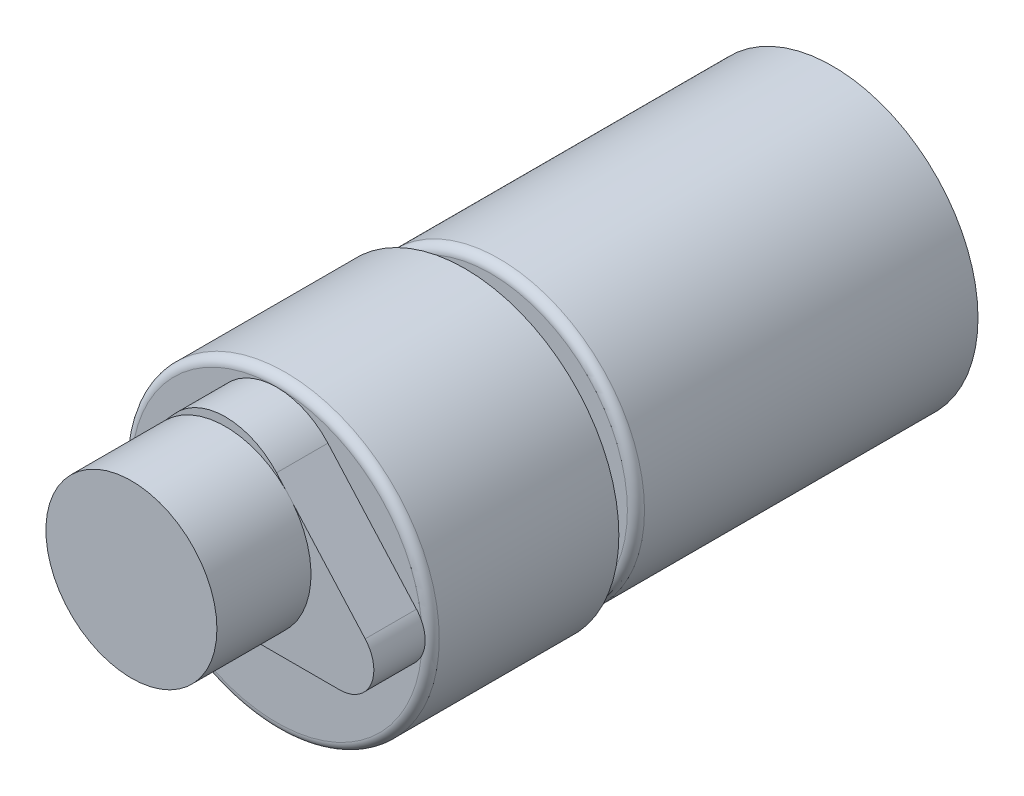
ISO-10303-21;
HEADER;
FILE_DESCRIPTION(('STEP AP214'),'2;1');
FILE_NAME('part.step','',(''),(''),'','','');
FILE_SCHEMA(('AUTOMOTIVE_DESIGN { 1 0 10303 214 1 1 1 1 }'));
ENDSEC;
DATA;
#1=APPLICATION_CONTEXT('core data for automotive mechanical design processes');
#2=APPLICATION_PROTOCOL_DEFINITION('international standard','automotive_design',2000,#1);
#3=PRODUCT_CONTEXT('',#1,'mechanical');
#4=PRODUCT('Part','Part','',(#3));
#5=PRODUCT_RELATED_PRODUCT_CATEGORY('part','',(#4));
#6=PRODUCT_DEFINITION_FORMATION('','',#4);
#7=PRODUCT_DEFINITION_CONTEXT('part definition',#1,'design');
#8=PRODUCT_DEFINITION('design','',#6,#7);
#9=PRODUCT_DEFINITION_SHAPE('','',#8);
#10=(LENGTH_UNIT() NAMED_UNIT(*) SI_UNIT(.MILLI.,.METRE.));
#11=(NAMED_UNIT(*) PLANE_ANGLE_UNIT() SI_UNIT($,.RADIAN.));
#12=(NAMED_UNIT(*) SI_UNIT($,.STERADIAN.) SOLID_ANGLE_UNIT());
#13=UNCERTAINTY_MEASURE_WITH_UNIT(LENGTH_MEASURE(1.E-05),#10,'distance_accuracy_value','');
#14=(GEOMETRIC_REPRESENTATION_CONTEXT(3) GLOBAL_UNCERTAINTY_ASSIGNED_CONTEXT((#13)) GLOBAL_UNIT_ASSIGNED_CONTEXT((#10,
#11,#12)) REPRESENTATION_CONTEXT('',''));
#15=CARTESIAN_POINT('',(0.,0.,0.));
#16=DIRECTION('',(0.,0.,1.));
#17=DIRECTION('',(1.,0.,0.));
#18=AXIS2_PLACEMENT_3D('',#15,#16,#17);
#19=CARTESIAN_POINT('',(0.,8.97293725574376,71.));
#20=DIRECTION('',(0.,0.,1.));
#21=DIRECTION('',(1.,0.,0.));
#22=AXIS2_PLACEMENT_3D('',#19,#20,#21);
#23=PLANE('',#22);
#24=CARTESIAN_POINT('',(0.,6.,71.));
#25=DIRECTION('',(0.,0.,1.));
#26=DIRECTION('',(1.,0.,0.));
#27=AXIS2_PLACEMENT_3D('',#24,#25,#26);
#28=CIRCLE('',#27,10.);
#29=CARTESIAN_POINT('',(7.0041768547025,13.1373318956071,71.));
#30=VERTEX_POINT('',#29);
#31=CARTESIAN_POINT('',(-7.0041768547025,13.1373318956071,71.));
#32=VERTEX_POINT('',#31);
#33=EDGE_CURVE('E11',#30,#32,#28,.T.);
#34=ORIENTED_EDGE('',*,*,#33,.F.);
#35=DIRECTION('',(-0.665166563949337,0.746695012842481,0.));
#36=VECTOR('',#35,1.);
#37=CARTESIAN_POINT('',(16.3369399847924,2.66066625579735,71.));
#38=LINE('',#37,#36);
#39=CARTESIAN_POINT('',(5.97356010273985,14.2942697673385,71.));
#40=VERTEX_POINT('',#39);
#41=EDGE_CURVE('E124',#30,#40,#38,.T.);
#42=ORIENTED_EDGE('',*,*,#41,.T.);
#43=CARTESIAN_POINT('',(0.,8.97293725574376,71.));
#44=DIRECTION('',(0.,0.,1.));
#45=DIRECTION('',(1.,0.,0.));
#46=AXIS2_PLACEMENT_3D('',#43,#44,#45);
#47=CIRCLE('',#46,8.);
#48=CARTESIAN_POINT('',(-5.97356010273985,14.2942697673385,71.));
#49=VERTEX_POINT('',#48);
#50=EDGE_CURVE('E143',#40,#49,#47,.T.);
#51=ORIENTED_EDGE('',*,*,#50,.T.);
#52=DIRECTION('',(-0.665166563949336,-0.746695012842481,0.));
#53=VECTOR('',#52,1.);
#54=CARTESIAN_POINT('',(-5.97356010273985,14.2942697673385,71.));
#55=LINE('',#54,#53);
#56=EDGE_CURVE('E148',#49,#32,#55,.T.);
#57=ORIENTED_EDGE('',*,*,#56,.T.);
#58=EDGE_LOOP('',(#34,#42,#51,#57));
#59=FACE_BOUND('',#58,.T.);
#60=ADVANCED_FACE('F33',(#59),#23,.T.);
#61=CARTESIAN_POINT('',(-7.89611982561368,12.1360648382779,71.));
#62=VERTEX_POINT('',#61);
#63=CARTESIAN_POINT('',(0.,-4.,71.));
#64=VERTEX_POINT('',#63);
#65=EDGE_CURVE('E42',#62,#64,#28,.T.);
#66=ORIENTED_EDGE('',*,*,#65,.F.);
#67=CARTESIAN_POINT('',(-16.3369399847924,2.66066625579734,71.));
#68=VERTEX_POINT('',#67);
#69=EDGE_CURVE('E146',#62,#68,#55,.T.);
#70=ORIENTED_EDGE('',*,*,#69,.T.);
#71=CARTESIAN_POINT('',(-13.3501599334225,0.,71.));
#72=DIRECTION('',(0.,0.,1.));
#73=DIRECTION('',(-1.,0.,0.));
#74=AXIS2_PLACEMENT_3D('',#71,#72,#73);
#75=CIRCLE('',#74,4.);
#76=CARTESIAN_POINT('',(-13.3501599334225,-4.,71.));
#77=VERTEX_POINT('',#76);
#78=EDGE_CURVE('E150',#68,#77,#75,.T.);
#79=ORIENTED_EDGE('',*,*,#78,.T.);
#80=DIRECTION('',(1.,0.,0.));
#81=VECTOR('',#80,1.);
#82=CARTESIAN_POINT('',(-13.3501599334225,-4.,71.));
#83=LINE('',#82,#81);
#84=EDGE_CURVE('E154',#77,#64,#83,.T.);
#85=ORIENTED_EDGE('',*,*,#84,.T.);
#86=EDGE_LOOP('',(#66,#70,#79,#85));
#87=FACE_BOUND('',#86,.T.);
#88=ADVANCED_FACE('F258',(#87),#23,.T.);
#89=CARTESIAN_POINT('',(0.,0.,65.));
#90=DIRECTION('',(0.,0.,1.));
#91=DIRECTION('',(1.,0.,0.));
#92=AXIS2_PLACEMENT_3D('',#89,#90,#91);
#93=PLANE('',#92);
#94=DIRECTION('',(1.,0.,0.));
#95=VECTOR('',#94,1.);
#96=CARTESIAN_POINT('',(-13.3501599334225,-4.,65.));
#97=LINE('',#96,#95);
#98=CARTESIAN_POINT('',(-13.3501599334225,-4.,65.));
#99=VERTEX_POINT('',#98);
#100=CARTESIAN_POINT('',(13.3501599334225,-4.,65.));
#101=VERTEX_POINT('',#100);
#102=EDGE_CURVE('E167',#99,#101,#97,.T.);
#103=ORIENTED_EDGE('',*,*,#102,.F.);
#104=CARTESIAN_POINT('',(-13.3501599334225,0.,65.));
#105=DIRECTION('',(0.,0.,1.));
#106=DIRECTION('',(-1.,0.,0.));
#107=AXIS2_PLACEMENT_3D('',#104,#105,#106);
#108=CIRCLE('',#107,4.);
#109=CARTESIAN_POINT('',(-16.8996765768439,-1.84416148915284,65.));
#110=VERTEX_POINT('',#109);
#111=EDGE_CURVE('E163',#110,#99,#108,.T.);
#112=ORIENTED_EDGE('',*,*,#111,.F.);
#113=CARTESIAN_POINT('',(0.,0.,65.));
#114=DIRECTION('',(0.,0.,1.));
#115=DIRECTION('',(1.,0.,0.));
#116=AXIS2_PLACEMENT_3D('',#113,#114,#115);
#117=CIRCLE('',#116,17.);
#118=CARTESIAN_POINT('',(16.8996765768439,-1.84416148915284,65.));
#119=VERTEX_POINT('',#118);
#120=EDGE_CURVE('E219',#110,#119,#117,.T.);
#121=ORIENTED_EDGE('',*,*,#120,.T.);
#122=CARTESIAN_POINT('',(13.3501599334225,0.,65.));
#123=DIRECTION('',(0.,0.,1.));
#124=DIRECTION('',(1.,0.,0.));
#125=AXIS2_PLACEMENT_3D('',#122,#123,#124);
#126=CIRCLE('',#125,4.);
#127=EDGE_CURVE('E172',#101,#119,#126,.T.);
#128=ORIENTED_EDGE('',*,*,#127,.F.);
#129=EDGE_LOOP('',(#103,#112,#121,#128));
#130=FACE_BOUND('',#129,.T.);
#131=ADVANCED_FACE('F227',(#130),#93,.T.);
#132=CARTESIAN_POINT('',(16.8996765768439,1.84416148915285,65.));
#133=VERTEX_POINT('',#132);
#134=CARTESIAN_POINT('',(-16.8996765768439,1.84416148915284,65.));
#135=VERTEX_POINT('',#134);
#136=EDGE_CURVE('E211',#133,#135,#117,.T.);
#137=ORIENTED_EDGE('',*,*,#136,.T.);
#138=CARTESIAN_POINT('',(-16.3369399847924,2.66066625579734,65.));
#139=VERTEX_POINT('',#138);
#140=EDGE_CURVE('E164',#139,#135,#108,.T.);
#141=ORIENTED_EDGE('',*,*,#140,.F.);
#142=DIRECTION('',(-0.665166563949336,-0.746695012842481,0.));
#143=VECTOR('',#142,1.);
#144=CARTESIAN_POINT('',(-5.97356010273985,14.2942697673385,65.));
#145=LINE('',#144,#143);
#146=CARTESIAN_POINT('',(-5.97356010273985,14.2942697673385,65.));
#147=VERTEX_POINT('',#146);
#148=EDGE_CURVE('E160',#147,#139,#145,.T.);
#149=ORIENTED_EDGE('',*,*,#148,.F.);
#150=CARTESIAN_POINT('',(0.,8.97293725574376,65.));
#151=DIRECTION('',(0.,0.,1.));
#152=DIRECTION('',(1.,0.,0.));
#153=AXIS2_PLACEMENT_3D('',#150,#151,#152);
#154=CIRCLE('',#153,8.);
#155=CARTESIAN_POINT('',(5.97356010273985,14.2942697673385,65.));
#156=VERTEX_POINT('',#155);
#157=EDGE_CURVE('E140',#156,#147,#154,.T.);
#158=ORIENTED_EDGE('',*,*,#157,.F.);
#159=DIRECTION('',(-0.665166563949337,0.746695012842481,0.));
#160=VECTOR('',#159,1.);
#161=CARTESIAN_POINT('',(16.3369399847924,2.66066625579735,65.));
#162=LINE('',#161,#160);
#163=CARTESIAN_POINT('',(16.3369399847924,2.66066625579735,65.));
#164=VERTEX_POINT('',#163);
#165=EDGE_CURVE('E147',#164,#156,#162,.T.);
#166=ORIENTED_EDGE('',*,*,#165,.F.);
#167=EDGE_CURVE('E171',#133,#164,#126,.T.);
#168=ORIENTED_EDGE('',*,*,#167,.F.);
#169=EDGE_LOOP('',(#137,#141,#149,#158,#166,#168));
#170=FACE_BOUND('',#169,.T.);
#171=ADVANCED_FACE('F245',(#170),#93,.T.);
#172=CARTESIAN_POINT('',(0.,0.,40.));
#173=DIRECTION('',(0.,0.,-1.));
#174=DIRECTION('',(-1.,0.,0.));
#175=AXIS2_PLACEMENT_3D('',#172,#173,#174);
#176=CYLINDRICAL_SURFACE('',#175,17.);
#177=CARTESIAN_POINT('',(0.,0.,39.));
#178=DIRECTION('',(0.,0.,1.));
#179=DIRECTION('',(1.,0.,0.));
#180=AXIS2_PLACEMENT_3D('',#177,#178,#179);
#181=CIRCLE('',#180,17.);
#182=CARTESIAN_POINT('',(17.,0.,39.));
#183=VERTEX_POINT('',#182);
#184=EDGE_CURVE('E208',#183,#183,#181,.F.);
#185=ORIENTED_EDGE('',*,*,#184,.T.);
#186=EDGE_LOOP('',(#185));
#187=FACE_BOUND('',#186,.T.);
#188=CARTESIAN_POINT('',(0.,0.,0.));
#189=DIRECTION('',(0.,0.,1.));
#190=DIRECTION('',(1.,0.,0.));
#191=AXIS2_PLACEMENT_3D('',#188,#189,#190);
#192=CIRCLE('',#191,17.);
#193=CARTESIAN_POINT('',(17.,0.,0.));
#194=VERTEX_POINT('',#193);
#195=EDGE_CURVE('E200',#194,#194,#192,.T.);
#196=ORIENTED_EDGE('',*,*,#195,.T.);
#197=EDGE_LOOP('',(#196));
#198=FACE_BOUND('',#197,.T.);
#199=ADVANCED_FACE('F355',(#187,#198),#176,.T.);
#200=CARTESIAN_POINT('',(0.,0.,40.));
#201=DIRECTION('',(0.,0.,1.));
#202=DIRECTION('',(1.,0.,0.));
#203=AXIS2_PLACEMENT_3D('',#200,#201,#202);
#204=PLANE('',#203);
#205=CARTESIAN_POINT('',(0.,0.,40.));
#206=DIRECTION('',(0.,0.,1.));
#207=DIRECTION('',(1.,0.,0.));
#208=AXIS2_PLACEMENT_3D('',#205,#206,#207);
#209=CIRCLE('',#208,16.);
#210=CARTESIAN_POINT('',(16.,0.,40.));
#211=VERTEX_POINT('',#210);
#212=EDGE_CURVE('E205',#211,#211,#209,.T.);
#213=ORIENTED_EDGE('',*,*,#212,.T.);
#214=EDGE_LOOP('',(#213));
#215=FACE_BOUND('',#214,.T.);
#216=CARTESIAN_POINT('',(0.,0.,40.));
#217=DIRECTION('',(0.,0.,1.));
#218=DIRECTION('',(1.,0.,0.));
#219=AXIS2_PLACEMENT_3D('',#216,#217,#218);
#220=CIRCLE('',#219,5.);
#221=CARTESIAN_POINT('',(5.,0.,40.));
#222=VERTEX_POINT('',#221);
#223=EDGE_CURVE('E196',#222,#222,#220,.T.);
#224=ORIENTED_EDGE('',*,*,#223,.F.);
#225=EDGE_LOOP('',(#224));
#226=FACE_BOUND('',#225,.T.);
#227=ADVANCED_FACE('F405',(#215,#226),#204,.T.);
#228=CARTESIAN_POINT('',(0.,0.,0.));
#229=DIRECTION('',(0.,0.,1.));
#230=DIRECTION('',(1.,0.,0.));
#231=AXIS2_PLACEMENT_3D('',#228,#229,#230);
#232=PLANE('',#231);
#233=ORIENTED_EDGE('',*,*,#195,.F.);
#234=EDGE_LOOP('',(#233));
#235=FACE_BOUND('',#234,.T.);
#236=ADVANCED_FACE('F395',(#235),#232,.F.);
#237=CARTESIAN_POINT('',(0.,0.,43.));
#238=DIRECTION('',(0.,0.,-1.));
#239=DIRECTION('',(-1.,0.,0.));
#240=AXIS2_PLACEMENT_3D('',#237,#238,#239);
#241=CYLINDRICAL_SURFACE('',#240,5.);
#242=CARTESIAN_POINT('',(0.,0.,43.));
#243=DIRECTION('',(0.,0.,1.));
#244=DIRECTION('',(1.,0.,0.));
#245=AXIS2_PLACEMENT_3D('',#242,#243,#244);
#246=CIRCLE('',#245,5.);
#247=CARTESIAN_POINT('',(5.,0.,43.));
#248=VERTEX_POINT('',#247);
#249=EDGE_CURVE('E197',#248,#248,#246,.T.);
#250=ORIENTED_EDGE('',*,*,#249,.F.);
#251=EDGE_LOOP('',(#250));
#252=FACE_BOUND('',#251,.T.);
#253=ORIENTED_EDGE('',*,*,#223,.T.);
#254=EDGE_LOOP('',(#253));
#255=FACE_BOUND('',#254,.T.);
#256=ADVANCED_FACE('F386',(#252,#255),#241,.T.);
#257=CARTESIAN_POINT('',(0.,0.,39.));
#258=DIRECTION('',(0.,0.,1.));
#259=DIRECTION('',(1.,0.,0.));
#260=AXIS2_PLACEMENT_3D('',#257,#258,#259);
#261=TOROIDAL_SURFACE('',#260,16.,1.);
#262=ORIENTED_EDGE('',*,*,#184,.F.);
#263=EDGE_LOOP('',(#262));
#264=FACE_BOUND('',#263,.T.);
#265=ORIENTED_EDGE('',*,*,#212,.F.);
#266=EDGE_LOOP('',(#265));
#267=FACE_BOUND('',#266,.T.);
#268=ADVANCED_FACE('F378',(#264,#267),#261,.T.);
#269=CARTESIAN_POINT('',(0.,0.,65.));
#270=DIRECTION('',(0.,0.,-1.));
#271=DIRECTION('',(-1.,0.,0.));
#272=AXIS2_PLACEMENT_3D('',#269,#270,#271);
#273=CYLINDRICAL_SURFACE('',#272,18.);
#274=CARTESIAN_POINT('',(0.,0.,64.));
#275=DIRECTION('',(0.,0.,1.));
#276=DIRECTION('',(1.,0.,0.));
#277=AXIS2_PLACEMENT_3D('',#274,#275,#276);
#278=CIRCLE('',#277,18.);
#279=CARTESIAN_POINT('',(18.,0.,64.));
#280=VERTEX_POINT('',#279);
#281=EDGE_CURVE('E37',#280,#280,#278,.F.);
#282=ORIENTED_EDGE('',*,*,#281,.T.);
#283=EDGE_LOOP('',(#282));
#284=FACE_BOUND('',#283,.T.);
#285=CARTESIAN_POINT('',(0.,0.,43.));
#286=DIRECTION('',(0.,0.,1.));
#287=DIRECTION('',(1.,0.,0.));
#288=AXIS2_PLACEMENT_3D('',#285,#286,#287);
#289=CIRCLE('',#288,18.);
#290=CARTESIAN_POINT('',(18.,0.,43.));
#291=VERTEX_POINT('',#290);
#292=EDGE_CURVE('E193',#291,#291,#289,.T.);
#293=ORIENTED_EDGE('',*,*,#292,.T.);
#294=EDGE_LOOP('',(#293));
#295=FACE_BOUND('',#294,.T.);
#296=ADVANCED_FACE('F369',(#284,#295),#273,.T.);
#297=CARTESIAN_POINT('',(0.,0.,43.));
#298=DIRECTION('',(0.,0.,1.));
#299=DIRECTION('',(1.,0.,0.));
#300=AXIS2_PLACEMENT_3D('',#297,#298,#299);
#301=PLANE('',#300);
#302=ORIENTED_EDGE('',*,*,#249,.T.);
#303=EDGE_LOOP('',(#302));
#304=FACE_BOUND('',#303,.T.);
#305=ORIENTED_EDGE('',*,*,#292,.F.);
#306=EDGE_LOOP('',(#305));
#307=FACE_BOUND('',#306,.T.);
#308=ADVANCED_FACE('F361',(#304,#307),#301,.F.);
#309=CARTESIAN_POINT('',(0.,0.,64.));
#310=DIRECTION('',(0.,0.,1.));
#311=DIRECTION('',(1.,0.,0.));
#312=AXIS2_PLACEMENT_3D('',#309,#310,#311);
#313=TOROIDAL_SURFACE('',#312,17.,1.);
#314=ORIENTED_EDGE('',*,*,#281,.F.);
#315=EDGE_LOOP('',(#314));
#316=FACE_BOUND('',#315,.T.);
#317=ORIENTED_EDGE('',*,*,#136,.F.);
#318=EDGE_CURVE('E210',#119,#133,#117,.T.);
#319=ORIENTED_EDGE('',*,*,#318,.F.);
#320=ORIENTED_EDGE('',*,*,#120,.F.);
#321=EDGE_CURVE('E213',#135,#110,#117,.T.);
#322=ORIENTED_EDGE('',*,*,#321,.F.);
#323=EDGE_LOOP('',(#317,#319,#320,#322));
#324=FACE_BOUND('',#323,.T.);
#325=ADVANCED_FACE('F35',(#316,#324),#313,.T.);
#326=CARTESIAN_POINT('',(0.,8.97293725574376,65.));
#327=DIRECTION('',(0.,0.,1.));
#328=DIRECTION('',(1.,0.,0.));
#329=AXIS2_PLACEMENT_3D('',#326,#327,#328);
#330=PLANE('',#329);
#331=ORIENTED_EDGE('',*,*,#321,.T.);
#332=EDGE_CURVE('E168',#135,#110,#108,.T.);
#333=ORIENTED_EDGE('',*,*,#332,.F.);
#334=EDGE_LOOP('',(#331,#333));
#335=FACE_BOUND('',#334,.T.);
#336=ADVANCED_FACE('F244',(#335),#330,.F.);
#337=CARTESIAN_POINT('',(0.,8.97293725574376,71.));
#338=DIRECTION('',(0.,0.,-1.));
#339=DIRECTION('',(-1.,0.,0.));
#340=AXIS2_PLACEMENT_3D('',#337,#338,#339);
#341=CYLINDRICAL_SURFACE('',#340,8.);
#342=ORIENTED_EDGE('',*,*,#157,.T.);
#343=DIRECTION('',(0.,0.,-1.));
#344=VECTOR('',#343,1.);
#345=CARTESIAN_POINT('',(-5.97356010273985,14.2942697673385,71.));
#346=LINE('',#345,#344);
#347=EDGE_CURVE('E190',#49,#147,#346,.T.);
#348=ORIENTED_EDGE('',*,*,#347,.F.);
#349=ORIENTED_EDGE('',*,*,#50,.F.);
#350=DIRECTION('',(0.,0.,-1.));
#351=VECTOR('',#350,1.);
#352=CARTESIAN_POINT('',(5.97356010273985,14.2942697673385,71.));
#353=LINE('',#352,#351);
#354=EDGE_CURVE('E121',#40,#156,#353,.T.);
#355=ORIENTED_EDGE('',*,*,#354,.T.);
#356=EDGE_LOOP('',(#342,#348,#349,#355));
#357=FACE_BOUND('',#356,.T.);
#358=ADVANCED_FACE('F248',(#357),#341,.T.);
#359=CARTESIAN_POINT('',(-5.97356010273985,14.2942697673385,71.));
#360=DIRECTION('',(0.746695012842481,-0.665166563949336,0.));
#361=DIRECTION('',(0.665166563949336,0.746695012842481,0.));
#362=AXIS2_PLACEMENT_3D('',#359,#360,#361);
#363=PLANE('',#362);
#364=ORIENTED_EDGE('',*,*,#148,.T.);
#365=DIRECTION('',(0.,0.,-1.));
#366=VECTOR('',#365,1.);
#367=CARTESIAN_POINT('',(-16.3369399847924,2.66066625579734,71.));
#368=LINE('',#367,#366);
#369=EDGE_CURVE('E187',#68,#139,#368,.T.);
#370=ORIENTED_EDGE('',*,*,#369,.F.);
#371=ORIENTED_EDGE('',*,*,#69,.F.);
#372=EDGE_CURVE('E151',#32,#62,#55,.T.);
#373=ORIENTED_EDGE('',*,*,#372,.F.);
#374=ORIENTED_EDGE('',*,*,#56,.F.);
#375=ORIENTED_EDGE('',*,*,#347,.T.);
#376=EDGE_LOOP('',(#364,#370,#371,#373,#374,#375));
#377=FACE_BOUND('',#376,.T.);
#378=ADVANCED_FACE('F259',(#377),#363,.F.);
#379=CARTESIAN_POINT('',(-13.3501599334225,0.,71.));
#380=DIRECTION('',(0.,0.,-1.));
#381=DIRECTION('',(-1.,0.,0.));
#382=AXIS2_PLACEMENT_3D('',#379,#380,#381);
#383=CYLINDRICAL_SURFACE('',#382,4.);
#384=ORIENTED_EDGE('',*,*,#140,.T.);
#385=ORIENTED_EDGE('',*,*,#332,.T.);
#386=ORIENTED_EDGE('',*,*,#111,.T.);
#387=DIRECTION('',(0.,0.,-1.));
#388=VECTOR('',#387,1.);
#389=CARTESIAN_POINT('',(-13.3501599334225,-4.,71.));
#390=LINE('',#389,#388);
#391=EDGE_CURVE('E184',#77,#99,#390,.T.);
#392=ORIENTED_EDGE('',*,*,#391,.F.);
#393=ORIENTED_EDGE('',*,*,#78,.F.);
#394=ORIENTED_EDGE('',*,*,#369,.T.);
#395=EDGE_LOOP('',(#384,#385,#386,#392,#393,#394));
#396=FACE_BOUND('',#395,.T.);
#397=ADVANCED_FACE('F241',(#396),#383,.T.);
#398=CARTESIAN_POINT('',(-13.3501599334225,-4.,71.));
#399=DIRECTION('',(0.,1.,0.));
#400=DIRECTION('',(0.,0.,1.));
#401=AXIS2_PLACEMENT_3D('',#398,#399,#400);
#402=PLANE('',#401);
#403=ORIENTED_EDGE('',*,*,#102,.T.);
#404=DIRECTION('',(0.,0.,-1.));
#405=VECTOR('',#404,1.);
#406=CARTESIAN_POINT('',(13.3501599334225,-4.,71.));
#407=LINE('',#406,#405);
#408=CARTESIAN_POINT('',(13.3501599334225,-4.,71.));
#409=VERTEX_POINT('',#408);
#410=EDGE_CURVE('E181',#409,#101,#407,.T.);
#411=ORIENTED_EDGE('',*,*,#410,.F.);
#412=EDGE_CURVE('E153',#64,#409,#83,.T.);
#413=ORIENTED_EDGE('',*,*,#412,.F.);
#414=ORIENTED_EDGE('',*,*,#84,.F.);
#415=ORIENTED_EDGE('',*,*,#391,.T.);
#416=EDGE_LOOP('',(#403,#411,#413,#414,#415));
#417=FACE_BOUND('',#416,.T.);
#418=ADVANCED_FACE('F236',(#417),#402,.F.);
#419=CARTESIAN_POINT('',(13.3501599334225,0.,71.));
#420=DIRECTION('',(0.,0.,-1.));
#421=DIRECTION('',(-1.,0.,0.));
#422=AXIS2_PLACEMENT_3D('',#419,#420,#421);
#423=CYLINDRICAL_SURFACE('',#422,4.);
#424=ORIENTED_EDGE('',*,*,#127,.T.);
#425=EDGE_CURVE('E175',#119,#133,#126,.T.);
#426=ORIENTED_EDGE('',*,*,#425,.T.);
#427=ORIENTED_EDGE('',*,*,#167,.T.);
#428=DIRECTION('',(0.,0.,-1.));
#429=VECTOR('',#428,1.);
#430=CARTESIAN_POINT('',(16.3369399847924,2.66066625579735,71.));
#431=LINE('',#430,#429);
#432=CARTESIAN_POINT('',(16.3369399847924,2.66066625579735,71.));
#433=VERTEX_POINT('',#432);
#434=EDGE_CURVE('E179',#433,#164,#431,.T.);
#435=ORIENTED_EDGE('',*,*,#434,.F.);
#436=CARTESIAN_POINT('',(13.3501599334225,0.,71.));
#437=DIRECTION('',(0.,0.,1.));
#438=DIRECTION('',(1.,0.,0.));
#439=AXIS2_PLACEMENT_3D('',#436,#437,#438);
#440=CIRCLE('',#439,4.);
#441=EDGE_CURVE('E117',#409,#433,#440,.T.);
#442=ORIENTED_EDGE('',*,*,#441,.F.);
#443=ORIENTED_EDGE('',*,*,#410,.T.);
#444=EDGE_LOOP('',(#424,#426,#427,#435,#442,#443));
#445=FACE_BOUND('',#444,.T.);
#446=ADVANCED_FACE('F233',(#445),#423,.T.);
#447=CARTESIAN_POINT('',(16.3369399847924,2.66066625579735,71.));
#448=DIRECTION('',(-0.746695012842481,-0.665166563949336,0.));
#449=DIRECTION('',(0.665166563949336,-0.746695012842481,0.));
#450=AXIS2_PLACEMENT_3D('',#447,#448,#449);
#451=PLANE('',#450);
#452=ORIENTED_EDGE('',*,*,#165,.T.);
#453=ORIENTED_EDGE('',*,*,#354,.F.);
#454=ORIENTED_EDGE('',*,*,#41,.F.);
#455=CARTESIAN_POINT('',(7.89611982561368,12.1360648382779,71.));
#456=VERTEX_POINT('',#455);
#457=EDGE_CURVE('E122',#456,#30,#38,.T.);
#458=ORIENTED_EDGE('',*,*,#457,.F.);
#459=EDGE_CURVE('E113',#433,#456,#38,.T.);
#460=ORIENTED_EDGE('',*,*,#459,.F.);
#461=ORIENTED_EDGE('',*,*,#434,.T.);
#462=EDGE_LOOP('',(#452,#453,#454,#458,#460,#461));
#463=FACE_BOUND('',#462,.T.);
#464=ADVANCED_FACE('F127',(#463),#451,.F.);
#465=EDGE_CURVE('E57',#64,#456,#28,.T.);
#466=ORIENTED_EDGE('',*,*,#465,.F.);
#467=ORIENTED_EDGE('',*,*,#412,.T.);
#468=ORIENTED_EDGE('',*,*,#441,.T.);
#469=ORIENTED_EDGE('',*,*,#459,.T.);
#470=EDGE_LOOP('',(#466,#467,#468,#469));
#471=FACE_BOUND('',#470,.T.);
#472=ADVANCED_FACE('F115',(#471),#23,.T.);
#473=ORIENTED_EDGE('',*,*,#318,.T.);
#474=ORIENTED_EDGE('',*,*,#425,.F.);
#475=EDGE_LOOP('',(#473,#474));
#476=FACE_BOUND('',#475,.T.);
#477=ADVANCED_FACE('F230',(#476),#330,.F.);
#478=CARTESIAN_POINT('',(0.,6.,71.));
#479=DIRECTION('',(0.,0.,1.));
#480=DIRECTION('',(1.,0.,0.));
#481=AXIS2_PLACEMENT_3D('',#478,#479,#480);
#482=PLANE('',#481);
#483=EDGE_CURVE('E44',#32,#62,#28,.T.);
#484=ORIENTED_EDGE('',*,*,#483,.F.);
#485=ORIENTED_EDGE('',*,*,#372,.T.);
#486=EDGE_LOOP('',(#484,#485));
#487=FACE_BOUND('',#486,.T.);
#488=ADVANCED_FACE('F254',(#487),#482,.F.);
#489=EDGE_CURVE('E135',#456,#30,#28,.T.);
#490=ORIENTED_EDGE('',*,*,#489,.F.);
#491=ORIENTED_EDGE('',*,*,#457,.T.);
#492=EDGE_LOOP('',(#490,#491));
#493=FACE_BOUND('',#492,.T.);
#494=ADVANCED_FACE('F137',(#493),#482,.F.);
#495=CARTESIAN_POINT('',(0.,6.,82.));
#496=DIRECTION('',(0.,0.,-1.));
#497=DIRECTION('',(-1.,0.,0.));
#498=AXIS2_PLACEMENT_3D('',#495,#496,#497);
#499=CYLINDRICAL_SURFACE('',#498,10.);
#500=CARTESIAN_POINT('',(0.,6.,82.));
#501=DIRECTION('',(0.,0.,1.));
#502=DIRECTION('',(1.,0.,0.));
#503=AXIS2_PLACEMENT_3D('',#500,#501,#502);
#504=CIRCLE('',#503,10.);
#505=CARTESIAN_POINT('',(10.,6.,82.));
#506=VERTEX_POINT('',#505);
#507=EDGE_CURVE('E138',#506,#506,#504,.T.);
#508=ORIENTED_EDGE('',*,*,#507,.F.);
#509=EDGE_LOOP('',(#508));
#510=FACE_BOUND('',#509,.T.);
#511=ORIENTED_EDGE('',*,*,#489,.T.);
#512=ORIENTED_EDGE('',*,*,#33,.T.);
#513=ORIENTED_EDGE('',*,*,#483,.T.);
#514=ORIENTED_EDGE('',*,*,#65,.T.);
#515=ORIENTED_EDGE('',*,*,#465,.T.);
#516=EDGE_LOOP('',(#511,#512,#513,#514,#515));
#517=FACE_BOUND('',#516,.T.);
#518=ADVANCED_FACE('F134',(#510,#517),#499,.T.);
#519=CARTESIAN_POINT('',(0.,6.,82.));
#520=DIRECTION('',(0.,0.,1.));
#521=DIRECTION('',(1.,0.,0.));
#522=AXIS2_PLACEMENT_3D('',#519,#520,#521);
#523=PLANE('',#522);
#524=ORIENTED_EDGE('',*,*,#507,.T.);
#525=EDGE_LOOP('',(#524));
#526=FACE_BOUND('',#525,.T.);
#527=ADVANCED_FACE('F464',(#526),#523,.T.);
#528=CLOSED_SHELL('',(#60,#88,#131,#171,#199,#227,#236,#256,#268,#296,#308,#325,#336,#358,#378,
#397,#418,#446,#464,#472,#477,#488,#494,#518,#527));
#529=MANIFOLD_SOLID_BREP('B2',#528);
#530=ADVANCED_BREP_SHAPE_REPRESENTATION('',(#18,#529),#14);
#531=SHAPE_DEFINITION_REPRESENTATION(#9,#530);
ENDSEC;
END-ISO-10303-21;
